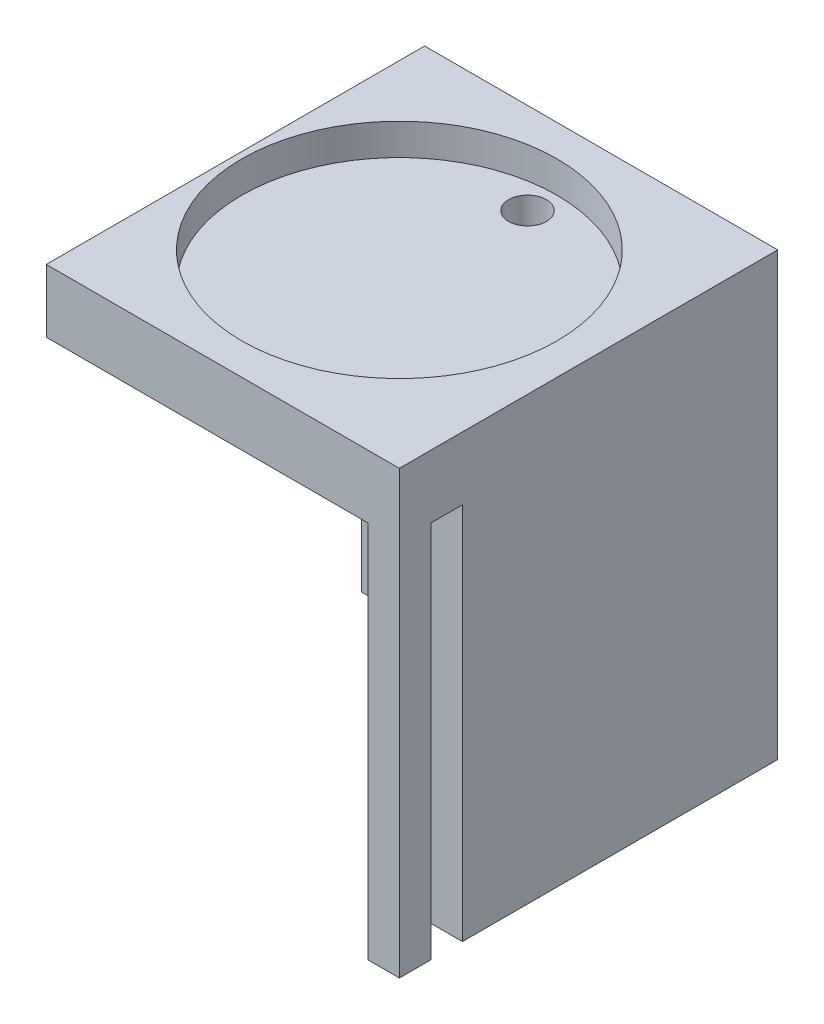
ISO-10303-21;
HEADER;
FILE_DESCRIPTION(('STEP AP214'),'2;1');
FILE_NAME('part.step','',(''),(''),'','','');
FILE_SCHEMA(('AUTOMOTIVE_DESIGN { 1 0 10303 214 1 1 1 1 }'));
ENDSEC;
DATA;
#1=APPLICATION_CONTEXT('core data for automotive mechanical design processes');
#2=APPLICATION_PROTOCOL_DEFINITION('international standard','automotive_design',2000,#1);
#3=PRODUCT_CONTEXT('',#1,'mechanical');
#4=PRODUCT('Part','Part','',(#3));
#5=PRODUCT_RELATED_PRODUCT_CATEGORY('part','',(#4));
#6=PRODUCT_DEFINITION_FORMATION('','',#4);
#7=PRODUCT_DEFINITION_CONTEXT('part definition',#1,'design');
#8=PRODUCT_DEFINITION('design','',#6,#7);
#9=PRODUCT_DEFINITION_SHAPE('','',#8);
#10=(LENGTH_UNIT() NAMED_UNIT(*) SI_UNIT(.MILLI.,.METRE.));
#11=(NAMED_UNIT(*) PLANE_ANGLE_UNIT() SI_UNIT($,.RADIAN.));
#12=(NAMED_UNIT(*) SI_UNIT($,.STERADIAN.) SOLID_ANGLE_UNIT());
#13=UNCERTAINTY_MEASURE_WITH_UNIT(LENGTH_MEASURE(1.E-05),#10,'distance_accuracy_value','');
#14=(GEOMETRIC_REPRESENTATION_CONTEXT(3) GLOBAL_UNCERTAINTY_ASSIGNED_CONTEXT((#13)) GLOBAL_UNIT_ASSIGNED_CONTEXT((#10,
#11,#12)) REPRESENTATION_CONTEXT('',''));
#15=CARTESIAN_POINT('',(0.,0.,0.));
#16=DIRECTION('',(0.,0.,1.));
#17=DIRECTION('',(1.,0.,0.));
#18=AXIS2_PLACEMENT_3D('',#15,#16,#17);
#19=CARTESIAN_POINT('',(0.,530.,0.));
#20=DIRECTION('',(0.,0.,-1.));
#21=DIRECTION('',(-1.,0.,0.));
#22=AXIS2_PLACEMENT_3D('',#19,#20,#21);
#23=PLANE('',#22);
#24=DIRECTION('',(0.,1.,0.));
#25=VECTOR('',#24,1.);
#26=CARTESIAN_POINT('',(660.,10.,0.));
#27=LINE('',#26,#25);
#28=CARTESIAN_POINT('',(660.,140.,0.));
#29=VERTEX_POINT('',#28);
#30=CARTESIAN_POINT('',(660.,260.,0.));
#31=VERTEX_POINT('',#30);
#32=EDGE_CURVE('E282',#29,#31,#27,.T.);
#33=ORIENTED_EDGE('',*,*,#32,.F.);
#34=DIRECTION('',(-1.,0.,0.));
#35=VECTOR('',#34,1.);
#36=CARTESIAN_POINT('',(670.,140.,0.));
#37=LINE('',#36,#35);
#38=CARTESIAN_POINT('',(670.,140.,0.));
#39=VERTEX_POINT('',#38);
#40=EDGE_CURVE('E172',#39,#29,#37,.T.);
#41=ORIENTED_EDGE('',*,*,#40,.F.);
#42=DIRECTION('',(0.,-1.,0.));
#43=VECTOR('',#42,1.);
#44=CARTESIAN_POINT('',(670.,530.,0.));
#45=LINE('',#44,#43);
#46=CARTESIAN_POINT('',(670.,280.,0.));
#47=VERTEX_POINT('',#46);
#48=EDGE_CURVE('E305',#47,#39,#45,.T.);
#49=ORIENTED_EDGE('',*,*,#48,.F.);
#50=DIRECTION('',(-1.,0.,0.));
#51=VECTOR('',#50,1.);
#52=CARTESIAN_POINT('',(0.,280.,0.));
#53=LINE('',#52,#51);
#54=CARTESIAN_POINT('',(558.,280.,0.));
#55=VERTEX_POINT('',#54);
#56=EDGE_CURVE('E194',#47,#55,#53,.T.);
#57=ORIENTED_EDGE('',*,*,#56,.T.);
#58=DIRECTION('',(0.,-1.,0.));
#59=VECTOR('',#58,1.);
#60=CARTESIAN_POINT('',(558.,0.,0.));
#61=LINE('',#60,#59);
#62=CARTESIAN_POINT('',(558.,260.,0.));
#63=VERTEX_POINT('',#62);
#64=EDGE_CURVE('E371',#55,#63,#61,.T.);
#65=ORIENTED_EDGE('',*,*,#64,.T.);
#66=DIRECTION('',(-1.,0.,0.));
#67=VECTOR('',#66,1.);
#68=CARTESIAN_POINT('',(9.99999999999982,260.,0.));
#69=LINE('',#68,#67);
#70=EDGE_CURVE('E287',#31,#63,#69,.T.);
#71=ORIENTED_EDGE('',*,*,#70,.F.);
#72=EDGE_LOOP('',(#33,#41,#49,#57,#65,#71));
#73=FACE_BOUND('',#72,.T.);
#74=ADVANCED_FACE('F38',(#73),#23,.F.);
#75=CARTESIAN_POINT('',(660.,10.,-100.));
#76=DIRECTION('',(1.,0.,0.));
#77=DIRECTION('',(0.,0.,-1.));
#78=AXIS2_PLACEMENT_3D('',#75,#76,#77);
#79=PLANE('',#78);
#80=DIRECTION('',(0.,-1.,0.));
#81=VECTOR('',#80,1.);
#82=CARTESIAN_POINT('',(660.,10.,-9.99999999999999));
#83=LINE('',#82,#81);
#84=CARTESIAN_POINT('',(660.,260.,-10.));
#85=VERTEX_POINT('',#84);
#86=CARTESIAN_POINT('',(660.,140.,-9.99999999999999));
#87=VERTEX_POINT('',#86);
#88=EDGE_CURVE('E259',#85,#87,#83,.T.);
#89=ORIENTED_EDGE('',*,*,#88,.T.);
#90=DIRECTION('',(0.,0.,1.));
#91=VECTOR('',#90,1.);
#92=CARTESIAN_POINT('',(660.,140.,-100.));
#93=LINE('',#92,#91);
#94=EDGE_CURVE('E53',#87,#29,#93,.T.);
#95=ORIENTED_EDGE('',*,*,#94,.T.);
#96=ORIENTED_EDGE('',*,*,#32,.T.);
#97=DIRECTION('',(0.,0.,1.));
#98=VECTOR('',#97,1.);
#99=CARTESIAN_POINT('',(660.,260.,-100.));
#100=LINE('',#99,#98);
#101=EDGE_CURVE('E292',#85,#31,#100,.T.);
#102=ORIENTED_EDGE('',*,*,#101,.F.);
#103=EDGE_LOOP('',(#89,#95,#96,#102));
#104=FACE_BOUND('',#103,.T.);
#105=ADVANCED_FACE('F340',(#104),#79,.F.);
#106=CARTESIAN_POINT('',(670.,530.,0.));
#107=DIRECTION('',(-1.,0.,0.));
#108=DIRECTION('',(0.,0.,1.));
#109=AXIS2_PLACEMENT_3D('',#106,#107,#108);
#110=PLANE('',#109);
#111=ORIENTED_EDGE('',*,*,#48,.T.);
#112=DIRECTION('',(0.,0.,-1.));
#113=VECTOR('',#112,1.);
#114=CARTESIAN_POINT('',(670.,140.,-120.));
#115=LINE('',#114,#113);
#116=CARTESIAN_POINT('',(670.,140.,-9.99999999999999));
#117=VERTEX_POINT('',#116);
#118=EDGE_CURVE('E393',#39,#117,#115,.T.);
#119=ORIENTED_EDGE('',*,*,#118,.T.);
#120=DIRECTION('',(0.,-1.,0.));
#121=VECTOR('',#120,1.);
#122=CARTESIAN_POINT('',(670.,10.,-10.));
#123=LINE('',#122,#121);
#124=CARTESIAN_POINT('',(670.,260.,-10.));
#125=VERTEX_POINT('',#124);
#126=EDGE_CURVE('E238',#125,#117,#123,.T.);
#127=ORIENTED_EDGE('',*,*,#126,.F.);
#128=DIRECTION('',(0.,0.,1.));
#129=VECTOR('',#128,1.);
#130=CARTESIAN_POINT('',(670.,260.,-10.));
#131=LINE('',#130,#129);
#132=CARTESIAN_POINT('',(670.,260.,-20.));
#133=VERTEX_POINT('',#132);
#134=EDGE_CURVE('E245',#133,#125,#131,.T.);
#135=ORIENTED_EDGE('',*,*,#134,.F.);
#136=DIRECTION('',(0.,1.,0.));
#137=VECTOR('',#136,1.);
#138=CARTESIAN_POINT('',(670.,10.,-20.));
#139=LINE('',#138,#137);
#140=CARTESIAN_POINT('',(670.,140.,-20.));
#141=VERTEX_POINT('',#140);
#142=EDGE_CURVE('E242',#141,#133,#139,.T.);
#143=ORIENTED_EDGE('',*,*,#142,.F.);
#144=CARTESIAN_POINT('',(670.,140.,-120.));
#145=VERTEX_POINT('',#144);
#146=EDGE_CURVE('E397',#141,#145,#115,.T.);
#147=ORIENTED_EDGE('',*,*,#146,.T.);
#148=DIRECTION('',(0.,-1.,0.));
#149=VECTOR('',#148,1.);
#150=CARTESIAN_POINT('',(670.,530.,-120.));
#151=LINE('',#150,#149);
#152=CARTESIAN_POINT('',(670.,280.,-120.));
#153=VERTEX_POINT('',#152);
#154=EDGE_CURVE('E169',#153,#145,#151,.T.);
#155=ORIENTED_EDGE('',*,*,#154,.F.);
#156=DIRECTION('',(0.,0.,1.));
#157=VECTOR('',#156,1.);
#158=CARTESIAN_POINT('',(670.,280.,-120.));
#159=LINE('',#158,#157);
#160=EDGE_CURVE('E184',#153,#47,#159,.T.);
#161=ORIENTED_EDGE('',*,*,#160,.T.);
#162=EDGE_LOOP('',(#111,#119,#127,#135,#143,#147,#155,#161));
#163=FACE_BOUND('',#162,.T.);
#164=ADVANCED_FACE('F342',(#163),#110,.F.);
#165=CARTESIAN_POINT('',(0.,530.,-120.));
#166=DIRECTION('',(0.,0.,1.));
#167=DIRECTION('',(1.,0.,0.));
#168=AXIS2_PLACEMENT_3D('',#165,#166,#167);
#169=PLANE('',#168);
#170=DIRECTION('',(0.,1.,0.));
#171=VECTOR('',#170,1.);
#172=CARTESIAN_POINT('',(645.198613037107,530.,-120.));
#173=LINE('',#172,#171);
#174=CARTESIAN_POINT('',(645.198613037107,230.,-120.));
#175=VERTEX_POINT('',#174);
#176=CARTESIAN_POINT('',(645.198613037107,260.,-120.));
#177=VERTEX_POINT('',#176);
#178=EDGE_CURVE('E230',#175,#177,#173,.T.);
#179=ORIENTED_EDGE('',*,*,#178,.T.);
#180=DIRECTION('',(-1.,0.,0.));
#181=VECTOR('',#180,1.);
#182=CARTESIAN_POINT('',(0.,260.,-120.));
#183=LINE('',#182,#181);
#184=CARTESIAN_POINT('',(625.198613037107,260.,-120.));
#185=VERTEX_POINT('',#184);
#186=EDGE_CURVE('E234',#177,#185,#183,.T.);
#187=ORIENTED_EDGE('',*,*,#186,.T.);
#188=DIRECTION('',(0.,-1.,0.));
#189=VECTOR('',#188,1.);
#190=CARTESIAN_POINT('',(625.198613037106,530.000000000002,-120.));
#191=LINE('',#190,#189);
#192=CARTESIAN_POINT('',(625.198613037107,230.,-120.));
#193=VERTEX_POINT('',#192);
#194=EDGE_CURVE('E214',#185,#193,#191,.T.);
#195=ORIENTED_EDGE('',*,*,#194,.T.);
#196=DIRECTION('',(1.,0.,0.));
#197=VECTOR('',#196,1.);
#198=CARTESIAN_POINT('',(0.,230.,-120.));
#199=LINE('',#198,#197);
#200=EDGE_CURVE('E226',#193,#175,#199,.T.);
#201=ORIENTED_EDGE('',*,*,#200,.T.);
#202=EDGE_LOOP('',(#179,#187,#195,#201));
#203=FACE_BOUND('',#202,.T.);
#204=ORIENTED_EDGE('',*,*,#154,.T.);
#205=DIRECTION('',(-1.,0.,0.));
#206=VECTOR('',#205,1.);
#207=CARTESIAN_POINT('',(670.,140.,-120.));
#208=LINE('',#207,#206);
#209=CARTESIAN_POINT('',(558.,140.,-120.));
#210=VERTEX_POINT('',#209);
#211=EDGE_CURVE('E158',#145,#210,#208,.T.);
#212=ORIENTED_EDGE('',*,*,#211,.T.);
#213=DIRECTION('',(0.,1.,0.));
#214=VECTOR('',#213,1.);
#215=CARTESIAN_POINT('',(558.,530.,-120.));
#216=LINE('',#215,#214);
#217=CARTESIAN_POINT('',(558.,280.,-120.));
#218=VERTEX_POINT('',#217);
#219=EDGE_CURVE('E166',#210,#218,#216,.T.);
#220=ORIENTED_EDGE('',*,*,#219,.T.);
#221=DIRECTION('',(1.,0.,0.));
#222=VECTOR('',#221,1.);
#223=CARTESIAN_POINT('',(0.,280.,-120.));
#224=LINE('',#223,#222);
#225=EDGE_CURVE('E179',#218,#153,#224,.T.);
#226=ORIENTED_EDGE('',*,*,#225,.T.);
#227=EDGE_LOOP('',(#204,#212,#220,#226));
#228=FACE_BOUND('',#227,.T.);
#229=ADVANCED_FACE('F165',(#203,#228),#169,.F.);
#230=CARTESIAN_POINT('',(9.99999999999982,260.,-100.));
#231=DIRECTION('',(0.,1.,0.));
#232=DIRECTION('',(0.,0.,1.));
#233=AXIS2_PLACEMENT_3D('',#230,#231,#232);
#234=PLANE('',#233);
#235=ORIENTED_EDGE('',*,*,#70,.T.);
#236=DIRECTION('',(0.,0.,-1.));
#237=VECTOR('',#236,1.);
#238=CARTESIAN_POINT('',(558.,260.,-100.));
#239=LINE('',#238,#237);
#240=CARTESIAN_POINT('',(558.,260.,-100.));
#241=VERTEX_POINT('',#240);
#242=EDGE_CURVE('E180',#63,#241,#239,.T.);
#243=ORIENTED_EDGE('',*,*,#242,.T.);
#244=DIRECTION('',(-1.,0.,0.));
#245=VECTOR('',#244,1.);
#246=CARTESIAN_POINT('',(9.99999999999982,260.,-100.));
#247=LINE('',#246,#245);
#248=CARTESIAN_POINT('',(603.622470889696,260.,-100.));
#249=VERTEX_POINT('',#248);
#250=EDGE_CURVE('E286',#249,#241,#247,.T.);
#251=ORIENTED_EDGE('',*,*,#250,.F.);
#252=CARTESIAN_POINT('',(609.516497097688,260.,-101.122699897348));
#253=DIRECTION('',(0.,1.,0.));
#254=DIRECTION('',(0.,0.,1.));
#255=AXIS2_PLACEMENT_3D('',#252,#253,#254);
#256=CIRCLE('',#255,6.00000000000001);
#257=CARTESIAN_POINT('',(615.41052330568,260.,-100.));
#258=VERTEX_POINT('',#257);
#259=EDGE_CURVE('E270',#249,#258,#256,.T.);
#260=ORIENTED_EDGE('',*,*,#259,.T.);
#261=CARTESIAN_POINT('',(625.198613037107,260.,-100.));
#262=VERTEX_POINT('',#261);
#263=EDGE_CURVE('E293',#262,#258,#247,.T.);
#264=ORIENTED_EDGE('',*,*,#263,.F.);
#265=DIRECTION('',(0.,0.,1.));
#266=VECTOR('',#265,1.);
#267=CARTESIAN_POINT('',(625.198613037107,260.,-180.));
#268=LINE('',#267,#266);
#269=EDGE_CURVE('E210',#185,#262,#268,.T.);
#270=ORIENTED_EDGE('',*,*,#269,.F.);
#271=ORIENTED_EDGE('',*,*,#186,.F.);
#272=DIRECTION('',(0.,0.,1.));
#273=VECTOR('',#272,1.);
#274=CARTESIAN_POINT('',(645.198613037107,260.,-180.));
#275=LINE('',#274,#273);
#276=CARTESIAN_POINT('',(645.198613037107,260.,-100.));
#277=VERTEX_POINT('',#276);
#278=EDGE_CURVE('E211',#177,#277,#275,.T.);
#279=ORIENTED_EDGE('',*,*,#278,.T.);
#280=CARTESIAN_POINT('',(660.,260.,-100.));
#281=VERTEX_POINT('',#280);
#282=EDGE_CURVE('E288',#281,#277,#247,.T.);
#283=ORIENTED_EDGE('',*,*,#282,.F.);
#284=CARTESIAN_POINT('',(660.,260.,-20.));
#285=VERTEX_POINT('',#284);
#286=EDGE_CURVE('E299',#281,#285,#100,.T.);
#287=ORIENTED_EDGE('',*,*,#286,.T.);
#288=DIRECTION('',(1.,0.,0.));
#289=VECTOR('',#288,1.);
#290=CARTESIAN_POINT('',(-47.0000000000002,260.,-20.));
#291=LINE('',#290,#289);
#292=EDGE_CURVE('E249',#285,#133,#291,.T.);
#293=ORIENTED_EDGE('',*,*,#292,.T.);
#294=ORIENTED_EDGE('',*,*,#134,.T.);
#295=DIRECTION('',(1.,0.,0.));
#296=VECTOR('',#295,1.);
#297=CARTESIAN_POINT('',(-47.0000000000002,260.,-10.));
#298=LINE('',#297,#296);
#299=EDGE_CURVE('E250',#85,#125,#298,.T.);
#300=ORIENTED_EDGE('',*,*,#299,.F.);
#301=ORIENTED_EDGE('',*,*,#101,.T.);
#302=EDGE_LOOP('',(#235,#243,#251,#260,#264,#270,#271,#279,#283,#287,#293,#294,#300,#301));
#303=FACE_BOUND('',#302,.T.);
#304=ADVANCED_FACE('F333',(#303),#234,.F.);
#305=DIRECTION('',(0.,1.,0.));
#306=VECTOR('',#305,1.);
#307=CARTESIAN_POINT('',(660.,10.,-100.));
#308=LINE('',#307,#306);
#309=CARTESIAN_POINT('',(660.,140.,-100.));
#310=VERTEX_POINT('',#309);
#311=EDGE_CURVE('E283',#310,#281,#308,.T.);
#312=ORIENTED_EDGE('',*,*,#311,.F.);
#313=DIRECTION('',(0.,0.,1.));
#314=VECTOR('',#313,1.);
#315=CARTESIAN_POINT('',(660.,140.,-100.));
#316=LINE('',#315,#314);
#317=CARTESIAN_POINT('',(660.,140.,-20.));
#318=VERTEX_POINT('',#317);
#319=EDGE_CURVE('E377',#310,#318,#316,.T.);
#320=ORIENTED_EDGE('',*,*,#319,.T.);
#321=DIRECTION('',(0.,1.,0.));
#322=VECTOR('',#321,1.);
#323=CARTESIAN_POINT('',(660.,10.,-20.));
#324=LINE('',#323,#322);
#325=EDGE_CURVE('E253',#318,#285,#324,.T.);
#326=ORIENTED_EDGE('',*,*,#325,.T.);
#327=ORIENTED_EDGE('',*,*,#286,.F.);
#328=EDGE_LOOP('',(#312,#320,#326,#327));
#329=FACE_BOUND('',#328,.T.);
#330=ADVANCED_FACE('F330',(#329),#79,.F.);
#331=CARTESIAN_POINT('',(0.,0.,-100.));
#332=DIRECTION('',(0.,0.,-1.));
#333=DIRECTION('',(-1.,0.,0.));
#334=AXIS2_PLACEMENT_3D('',#331,#332,#333);
#335=PLANE('',#334);
#336=DIRECTION('',(0.,-1.,0.));
#337=VECTOR('',#336,1.);
#338=CARTESIAN_POINT('',(558.,0.,-100.));
#339=LINE('',#338,#337);
#340=CARTESIAN_POINT('',(558.,140.,-100.));
#341=VERTEX_POINT('',#340);
#342=EDGE_CURVE('E187',#241,#341,#339,.T.);
#343=ORIENTED_EDGE('',*,*,#342,.T.);
#344=DIRECTION('',(1.,0.,0.));
#345=VECTOR('',#344,1.);
#346=CARTESIAN_POINT('',(0.,140.,-100.));
#347=LINE('',#346,#345);
#348=EDGE_CURVE('E61',#341,#310,#347,.T.);
#349=ORIENTED_EDGE('',*,*,#348,.T.);
#350=ORIENTED_EDGE('',*,*,#311,.T.);
#351=ORIENTED_EDGE('',*,*,#282,.T.);
#352=DIRECTION('',(0.,1.,0.));
#353=VECTOR('',#352,1.);
#354=CARTESIAN_POINT('',(645.198613037107,260.,-100.));
#355=LINE('',#354,#353);
#356=CARTESIAN_POINT('',(645.198613037107,230.,-100.));
#357=VERTEX_POINT('',#356);
#358=EDGE_CURVE('E206',#357,#277,#355,.T.);
#359=ORIENTED_EDGE('',*,*,#358,.F.);
#360=DIRECTION('',(1.,0.,0.));
#361=VECTOR('',#360,1.);
#362=CARTESIAN_POINT('',(625.198613037107,230.,-100.));
#363=LINE('',#362,#361);
#364=CARTESIAN_POINT('',(625.198613037107,230.,-100.));
#365=VERTEX_POINT('',#364);
#366=EDGE_CURVE('E202',#365,#357,#363,.T.);
#367=ORIENTED_EDGE('',*,*,#366,.F.);
#368=DIRECTION('',(0.,-1.,0.));
#369=VECTOR('',#368,1.);
#370=CARTESIAN_POINT('',(625.198613037107,260.,-100.));
#371=LINE('',#370,#369);
#372=EDGE_CURVE('E198',#262,#365,#371,.T.);
#373=ORIENTED_EDGE('',*,*,#372,.F.);
#374=ORIENTED_EDGE('',*,*,#263,.T.);
#375=DIRECTION('',(0.,1.,0.));
#376=VECTOR('',#375,1.);
#377=CARTESIAN_POINT('',(615.41052330568,270.,-100.));
#378=LINE('',#377,#376);
#379=CARTESIAN_POINT('',(615.41052330568,240.,-100.));
#380=VERTEX_POINT('',#379);
#381=EDGE_CURVE('E319',#258,#380,#378,.F.);
#382=ORIENTED_EDGE('',*,*,#381,.T.);
#383=CARTESIAN_POINT('',(579.010817110295,254.736907236427,-100.));
#384=CARTESIAN_POINT('',(580.064485461513,254.104231159984,-100.));
#385=CARTESIAN_POINT('',(581.118170531218,253.471582920944,-100.));
#386=CARTESIAN_POINT('',(583.225597589703,252.206377004348,-100.));
#387=CARTESIAN_POINT('',(584.279339578581,251.573819326955,-100.));
#388=CARTESIAN_POINT('',(586.386955671744,250.308798381958,-100.));
#389=CARTESIAN_POINT('',(587.440829780064,249.676335121075,-100.));
#390=CARTESIAN_POINT('',(589.548693446274,248.4116051581,-100.));
#391=CARTESIAN_POINT('',(590.60268300396,247.779338455669,-100.));
#392=CARTESIAN_POINT('',(592.725203257284,246.506508418519,-100.));
#393=CARTESIAN_POINT('',(593.793736513587,245.865949352983,-100.));
#394=CARTESIAN_POINT('',(595.396801974486,244.905547487372,-100.));
#395=CARTESIAN_POINT('',(595.931202829409,244.585485460179,-100.));
#396=CARTESIAN_POINT('',(597.000130148606,243.945571848214,-100.));
#397=CARTESIAN_POINT('',(597.534656612814,243.625720263332,-100.));
#398=CARTESIAN_POINT('',(598.603873229973,242.986336773128,-100.));
#399=CARTESIAN_POINT('',(599.138563375945,242.66680485614,-100.));
#400=CARTESIAN_POINT('',(600.208232950862,242.028223143499,-100.));
#401=CARTESIAN_POINT('',(600.743212380385,241.709173348814,-100.));
#402=CARTESIAN_POINT('',(601.81364134488,241.071874121645,-100.));
#403=CARTESIAN_POINT('',(602.34909087527,240.753624681475,-100.));
#404=CARTESIAN_POINT('',(603.152947508334,240.277403948793,-100.));
#405=CARTESIAN_POINT('',(603.421013010738,240.118856196473,-100.));
#406=CARTESIAN_POINT('',(603.957480419703,239.802331010719,-100.));
#407=CARTESIAN_POINT('',(604.225882325852,239.644353576585,-100.));
#408=CARTESIAN_POINT('',(604.5988037609,239.425679597394,-100.));
#409=CARTESIAN_POINT('',(604.703103960806,239.364609073491,-100.));
#410=CARTESIAN_POINT('',(604.911799643123,239.242630970474,-100.));
#411=CARTESIAN_POINT('',(605.016195125588,239.181723391454,-100.));
#412=CARTESIAN_POINT('',(605.329557735671,238.99928928014,-100.));
#413=CARTESIAN_POINT('',(605.538695259016,238.878054759873,-100.));
#414=CARTESIAN_POINT('',(605.957248937048,238.637032006426,-100.));
#415=CARTESIAN_POINT('',(606.166663710999,238.517241376926,-100.));
#416=CARTESIAN_POINT('',(606.586596892621,238.279629821976,-100.));
#417=CARTESIAN_POINT('',(606.797115226832,238.16180876755,-100.));
#418=CARTESIAN_POINT('',(607.121248849038,237.98406405024,-100.));
#419=CARTESIAN_POINT('',(607.234143678677,237.922830440583,-100.));
#420=CARTESIAN_POINT('',(607.46077225373,237.801893621931,-100.));
#421=CARTESIAN_POINT('',(607.574506113992,237.74219062765,-100.));
#422=CARTESIAN_POINT('',(607.803670197733,237.624852792922,-100.));
#423=CARTESIAN_POINT('',(607.919105626286,237.56722799868,-100.));
#424=CARTESIAN_POINT('',(608.093628278135,237.483670531972,-100.));
#425=CARTESIAN_POINT('',(608.152025388404,237.456300349025,-100.));
#426=CARTESIAN_POINT('',(608.269393827435,237.402824133321,-100.));
#427=CARTESIAN_POINT('',(608.32836512168,237.376718025134,-100.));
#428=CARTESIAN_POINT('',(608.455620218305,237.322502742292,-100.));
#429=CARTESIAN_POINT('',(608.524015027124,237.294651600535,-100.));
#430=CARTESIAN_POINT('',(608.661996793455,237.241982702947,-100.));
#431=CARTESIAN_POINT('',(608.731584008968,237.217165613289,-100.));
#432=CARTESIAN_POINT('',(608.871583518835,237.171995701995,-100.));
#433=CARTESIAN_POINT('',(608.94198419481,237.151607584979,-100.));
#434=CARTESIAN_POINT('',(609.084227469,237.116649935087,-100.));
#435=CARTESIAN_POINT('',(609.156069226653,237.102077108254,-100.));
#436=CARTESIAN_POINT('',(609.287399091293,237.082470862284,-100.));
#437=CARTESIAN_POINT('',(609.346693412188,237.076165525243,-100.));
#438=CARTESIAN_POINT('',(609.465608604954,237.069180337324,-100.));
#439=CARTESIAN_POINT('',(609.525229378342,237.06849887434,-100.));
#440=CARTESIAN_POINT('',(609.644452946972,237.072843524842,-100.));
#441=CARTESIAN_POINT('',(609.704055030317,237.077888526484,-100.));
#442=CARTESIAN_POINT('',(609.822574241125,237.093174999284,-100.));
#443=CARTESIAN_POINT('',(609.881491270088,237.103417208497,-100.));
#444=CARTESIAN_POINT('',(610.024595428082,237.133756118527,-100.));
#445=CARTESIAN_POINT('',(610.108273960249,237.156212095037,-100.));
#446=CARTESIAN_POINT('',(610.273722153184,237.207397218453,-100.));
#447=CARTESIAN_POINT('',(610.355489262582,237.236134273028,-100.));
#448=CARTESIAN_POINT('',(610.517738468658,237.297926782164,-100.));
#449=CARTESIAN_POINT('',(610.598213800607,237.330999712354,-100.));
#450=CARTESIAN_POINT('',(610.757877063554,237.399982605282,-100.));
#451=CARTESIAN_POINT('',(610.837065595083,237.435891195963,-100.));
#452=CARTESIAN_POINT('',(610.995898460792,237.510331232749,-100.));
#453=CARTESIAN_POINT('',(611.075526249826,237.548897740089,-100.));
#454=CARTESIAN_POINT('',(611.234068814276,237.627480152907,-100.));
#455=CARTESIAN_POINT('',(611.312983523433,237.667496191376,-100.));
#456=CARTESIAN_POINT('',(611.470052941163,237.748469154222,-100.));
#457=CARTESIAN_POINT('',(611.548209141397,237.789423194045,-100.));
#458=CARTESIAN_POINT('',(611.704101015729,237.872114700255,-100.));
#459=CARTESIAN_POINT('',(611.781836706502,237.91385213528,-100.));
#460=CARTESIAN_POINT('',(612.036169390439,238.051654366385,-100.));
#461=CARTESIAN_POINT('',(612.212096425044,238.148954096322,-100.));
#462=CARTESIAN_POINT('',(612.56296671254,238.345314180964,-100.));
#463=CARTESIAN_POINT('',(612.737909930497,238.444374597676,-100.));
#464=CARTESIAN_POINT('',(613.087172450907,238.643626644001,-100.));
#465=CARTESIAN_POINT('',(613.261491692711,238.743818379844,-100.));
#466=CARTESIAN_POINT('',(613.609695952904,238.944954098754,-100.));
#467=CARTESIAN_POINT('',(613.783580969298,239.045898085268,-100.));
#468=CARTESIAN_POINT('',(614.305198668206,239.34974757573,-100.));
#469=CARTESIAN_POINT('',(614.652477687977,239.553431413879,-100.));
#470=CARTESIAN_POINT('',(615.346361772551,239.961897744248,-100.));
#471=CARTESIAN_POINT('',(615.692966873269,240.166680175605,-100.));
#472=CARTESIAN_POINT('',(616.380412247215,240.573753442597,-100.));
#473=CARTESIAN_POINT('',(616.721258728453,240.776033795877,-100.));
#474=CARTESIAN_POINT('',(617.402700541204,241.181028276847,-100.));
#475=CARTESIAN_POINT('',(617.743295868938,241.383742410893,-100.));
#476=CARTESIAN_POINT('',(618.42416548712,241.789382073193,-100.));
#477=CARTESIAN_POINT('',(618.764439852417,241.992307475828,-100.));
#478=CARTESIAN_POINT('',(619.444859218411,242.398371527395,-100.));
#479=CARTESIAN_POINT('',(619.785004219683,242.601510175362,-100.));
#480=CARTESIAN_POINT('',(620.976724023493,243.313586072234,-100.));
#481=CARTESIAN_POINT('',(621.828055975153,243.822929712478,-100.));
#482=CARTESIAN_POINT('',(623.530419574978,244.842121616094,-100.));
#483=CARTESIAN_POINT('',(624.381451222634,245.351969880318,-100.));
#484=CARTESIAN_POINT('',(626.934583078903,246.882135475321,-100.));
#485=CARTESIAN_POINT('',(628.636419167318,247.902893472661,-100.));
#486=CARTESIAN_POINT('',(632.089080343556,249.974468165039,-100.));
#487=CARTESIAN_POINT('',(633.839896801331,251.025299238028,-100.));
#488=CARTESIAN_POINT('',(636.465834890892,252.601661847611,-100.));
#489=CARTESIAN_POINT('',(637.341020081696,253.127087498659,-100.));
#490=CARTESIAN_POINT('',(639.091357625422,254.177993150883,-100.));
#491=CARTESIAN_POINT('',(639.966509978348,254.703473152052,-100.));
#492=CARTESIAN_POINT('',(640.841650821006,255.228972316307,-100.));
#493=B_SPLINE_CURVE_WITH_KNOTS('',3,(#383,#384,#385,#386,#387,#388,#389,#390,#391,#392,#393,
#394,#395,#396,#397,#398,#399,#400,#401,#402,#403,#404,#405,#406,#407,#408,#409,#410,#411,#412,
#413,#414,#415,#416,#417,#418,#419,#420,#421,#422,#423,#424,#425,#426,#427,#428,#429,#430,#431,
#432,#433,#434,#435,#436,#437,#438,#439,#440,#441,#442,#443,#444,#445,#446,#447,#448,#449,#450,
#451,#452,#453,#454,#455,#456,#457,#458,#459,#460,#461,#462,#463,#464,#465,#466,#467,#468,#469,
#470,#471,#472,#473,#474,#475,#476,#477,#478,#479,#480,#481,#482,#483,#484,#485,#486,#487,#488,
#489,#490,#491,#492),.UNSPECIFIED.,.F.,.F.,(4,2,2,2,2,2,2,2,2,2,2,2,2,2,2,2,2,2,2,2,2,2,2,2,2,2,
2,2,2,2,2,2,2,2,2,2,2,2,2,2,2,2,2,2,2,2,2,2,2,2,2,2,2,2,4),(0.,3.68706714570591,
7.37414085194982,11.0614086203671,14.7486699862425,18.4861440267546,20.3548911054658,
22.2236372069734,24.0923124200723,25.9609913771879,27.8296523203124,28.7639797875429,
29.6983061075908,30.060898387709,30.4234908768716,31.1486959180865,31.8724590721655,
32.5961746436826,32.9814624312326,33.3668039741919,33.7538098315314,33.947277669537,
34.1407339485546,34.3622273670395,34.5837693307661,34.803475141829,35.0230563276392,
35.2017019872668,35.3802964356112,35.5594816755622,35.7386923687519,35.9982201674631,
36.2580766046668,36.5190145796222,36.7798270624682,37.045234074384,37.3106654986628,
37.5753682448035,37.8400604163947,38.443162345494,39.0462855569078,39.6494658803116,
40.2526489691323,41.4604555281976,42.6681958515785,43.8572465823877,45.0463148541447,
46.2348803744179,47.4234405384703,50.399641261938,53.3758470225277,59.3293109837373,
65.4551936079142,68.5175768421518,71.5799595460392),.UNSPECIFIED.);
#494=CARTESIAN_POINT('',(603.622470889696,240.,-100.));
#495=VERTEX_POINT('',#494);
#496=EDGE_CURVE('E309',#380,#495,#493,.F.);
#497=ORIENTED_EDGE('',*,*,#496,.T.);
#498=DIRECTION('',(0.,1.,0.));
#499=VECTOR('',#498,1.);
#500=CARTESIAN_POINT('',(603.622470889696,270.,-100.));
#501=LINE('',#500,#499);
#502=EDGE_CURVE('E46',#495,#249,#501,.T.);
#503=ORIENTED_EDGE('',*,*,#502,.T.);
#504=ORIENTED_EDGE('',*,*,#250,.T.);
#505=EDGE_LOOP('',(#343,#349,#350,#351,#359,#367,#373,#374,#382,#497,#503,#504));
#506=FACE_BOUND('',#505,.T.);
#507=ADVANCED_FACE('F324',(#506),#335,.F.);
#508=CARTESIAN_POINT('',(340.,280.,-100.));
#509=DIRECTION('',(0.,-1.,0.));
#510=DIRECTION('',(0.,0.,-1.));
#511=AXIS2_PLACEMENT_3D('',#508,#509,#510);
#512=PLANE('',#511);
#513=CARTESIAN_POINT('',(610.,280.,-60.));
#514=DIRECTION('',(0.,-1.,0.));
#515=DIRECTION('',(0.,0.,-1.));
#516=AXIS2_PLACEMENT_3D('',#513,#514,#515);
#517=CIRCLE('',#516,50.);
#518=CARTESIAN_POINT('',(610.,280.,-110.));
#519=VERTEX_POINT('',#518);
#520=EDGE_CURVE('E278',#519,#519,#517,.T.);
#521=ORIENTED_EDGE('',*,*,#520,.T.);
#522=EDGE_LOOP('',(#521));
#523=FACE_BOUND('',#522,.T.);
#524=ORIENTED_EDGE('',*,*,#225,.F.);
#525=DIRECTION('',(0.,0.,-1.));
#526=VECTOR('',#525,1.);
#527=CARTESIAN_POINT('',(558.,280.,0.));
#528=LINE('',#527,#526);
#529=EDGE_CURVE('E176',#55,#218,#528,.T.);
#530=ORIENTED_EDGE('',*,*,#529,.F.);
#531=ORIENTED_EDGE('',*,*,#56,.F.);
#532=ORIENTED_EDGE('',*,*,#160,.F.);
#533=EDGE_LOOP('',(#524,#530,#531,#532));
#534=FACE_BOUND('',#533,.T.);
#535=ADVANCED_FACE('F329',(#523,#534),#512,.F.);
#536=CARTESIAN_POINT('',(610.,270.,-60.));
#537=DIRECTION('',(0.,1.,0.));
#538=DIRECTION('',(0.,0.,1.));
#539=AXIS2_PLACEMENT_3D('',#536,#537,#538);
#540=CYLINDRICAL_SURFACE('',#539,50.);
#541=CARTESIAN_POINT('',(610.,270.,-60.));
#542=DIRECTION('',(0.,1.,0.));
#543=DIRECTION('',(0.,0.,1.));
#544=AXIS2_PLACEMENT_3D('',#541,#542,#543);
#545=CIRCLE('',#544,50.);
#546=CARTESIAN_POINT('',(610.,270.,-9.99999999999997));
#547=VERTEX_POINT('',#546);
#548=EDGE_CURVE('E274',#547,#547,#545,.T.);
#549=ORIENTED_EDGE('',*,*,#548,.F.);
#550=EDGE_LOOP('',(#549));
#551=FACE_BOUND('',#550,.T.);
#552=ORIENTED_EDGE('',*,*,#520,.F.);
#553=EDGE_LOOP('',(#552));
#554=FACE_BOUND('',#553,.T.);
#555=ADVANCED_FACE('F449',(#551,#554),#540,.F.);
#556=CARTESIAN_POINT('',(610.,270.,-60.));
#557=DIRECTION('',(0.,1.,0.));
#558=DIRECTION('',(0.,0.,1.));
#559=AXIS2_PLACEMENT_3D('',#556,#557,#558);
#560=PLANE('',#559);
#561=CARTESIAN_POINT('',(609.516497097688,270.,-101.122699897348));
#562=DIRECTION('',(0.,1.,0.));
#563=DIRECTION('',(0.,0.,1.));
#564=AXIS2_PLACEMENT_3D('',#561,#562,#563);
#565=CIRCLE('',#564,6.00000000000001);
#566=CARTESIAN_POINT('',(609.516497097688,270.,-95.1226998973476));
#567=VERTEX_POINT('',#566);
#568=EDGE_CURVE('E263',#567,#567,#565,.T.);
#569=ORIENTED_EDGE('',*,*,#568,.F.);
#570=EDGE_LOOP('',(#569));
#571=FACE_BOUND('',#570,.T.);
#572=ORIENTED_EDGE('',*,*,#548,.T.);
#573=EDGE_LOOP('',(#572));
#574=FACE_BOUND('',#573,.T.);
#575=ADVANCED_FACE('F442',(#571,#574),#560,.T.);
#576=CARTESIAN_POINT('',(609.516497097688,270.,-101.122699897348));
#577=DIRECTION('',(0.,1.,0.));
#578=DIRECTION('',(0.,0.,1.));
#579=AXIS2_PLACEMENT_3D('',#576,#577,#578);
#580=CYLINDRICAL_SURFACE('',#579,6.00000000000001);
#581=ORIENTED_EDGE('',*,*,#568,.T.);
#582=EDGE_LOOP('',(#581));
#583=FACE_BOUND('',#582,.T.);
#584=CARTESIAN_POINT('',(609.516497097688,240.,-101.122699897348));
#585=DIRECTION('',(0.,1.,0.));
#586=DIRECTION('',(0.,0.,1.));
#587=AXIS2_PLACEMENT_3D('',#584,#585,#586);
#588=CIRCLE('',#587,6.00000000000001);
#589=EDGE_CURVE('E267',#380,#495,#588,.T.);
#590=ORIENTED_EDGE('',*,*,#589,.F.);
#591=ORIENTED_EDGE('',*,*,#381,.F.);
#592=ORIENTED_EDGE('',*,*,#259,.F.);
#593=ORIENTED_EDGE('',*,*,#502,.F.);
#594=EDGE_LOOP('',(#590,#591,#592,#593));
#595=FACE_BOUND('',#594,.T.);
#596=ADVANCED_FACE('F440',(#583,#595),#580,.F.);
#597=CARTESIAN_POINT('',(609.516497097688,240.,-101.122699897348));
#598=DIRECTION('',(0.,1.,0.));
#599=DIRECTION('',(0.,0.,1.));
#600=AXIS2_PLACEMENT_3D('',#597,#598,#599);
#601=CONICAL_SURFACE('',#600,6.00000000000001,1.02974425867666);
#602=CARTESIAN_POINT('',(609.516497097688,236.394836285835,-101.122699897348));
#603=VERTEX_POINT('',#602);
#604=VERTEX_LOOP('',#603);
#605=FACE_BOUND('',#604,.T.);
#606=ORIENTED_EDGE('',*,*,#589,.T.);
#607=ORIENTED_EDGE('',*,*,#496,.F.);
#608=EDGE_LOOP('',(#606,#607));
#609=FACE_BOUND('',#608,.T.);
#610=ADVANCED_FACE('F320',(#605,#609),#601,.F.);
#611=CARTESIAN_POINT('',(-47.0000000000002,10.,-20.));
#612=DIRECTION('',(0.,0.,-1.));
#613=DIRECTION('',(-1.,0.,0.));
#614=AXIS2_PLACEMENT_3D('',#611,#612,#613);
#615=PLANE('',#614);
#616=ORIENTED_EDGE('',*,*,#325,.F.);
#617=DIRECTION('',(1.,0.,0.));
#618=VECTOR('',#617,1.);
#619=CARTESIAN_POINT('',(-47.0000000000002,140.,-20.));
#620=LINE('',#619,#618);
#621=EDGE_CURVE('E384',#318,#141,#620,.T.);
#622=ORIENTED_EDGE('',*,*,#621,.T.);
#623=ORIENTED_EDGE('',*,*,#142,.T.);
#624=ORIENTED_EDGE('',*,*,#292,.F.);
#625=EDGE_LOOP('',(#616,#622,#623,#624));
#626=FACE_BOUND('',#625,.T.);
#627=ADVANCED_FACE('F404',(#626),#615,.F.);
#628=CARTESIAN_POINT('',(-47.0000000000002,10.,-10.));
#629=DIRECTION('',(0.,0.,1.));
#630=DIRECTION('',(1.,0.,0.));
#631=AXIS2_PLACEMENT_3D('',#628,#629,#630);
#632=PLANE('',#631);
#633=ORIENTED_EDGE('',*,*,#126,.T.);
#634=DIRECTION('',(-1.,0.,0.));
#635=VECTOR('',#634,1.);
#636=CARTESIAN_POINT('',(-47.0000000000002,140.,-10.));
#637=LINE('',#636,#635);
#638=EDGE_CURVE('E171',#117,#87,#637,.T.);
#639=ORIENTED_EDGE('',*,*,#638,.T.);
#640=ORIENTED_EDGE('',*,*,#88,.F.);
#641=ORIENTED_EDGE('',*,*,#299,.T.);
#642=EDGE_LOOP('',(#633,#639,#640,#641));
#643=FACE_BOUND('',#642,.T.);
#644=ADVANCED_FACE('F437',(#643),#632,.F.);
#645=CARTESIAN_POINT('',(645.198613037107,260.,-180.));
#646=DIRECTION('',(1.,0.,0.));
#647=DIRECTION('',(0.,0.,-1.));
#648=AXIS2_PLACEMENT_3D('',#645,#646,#647);
#649=PLANE('',#648);
#650=DIRECTION('',(0.,0.,1.));
#651=VECTOR('',#650,1.);
#652=CARTESIAN_POINT('',(645.198613037107,230.,-180.));
#653=LINE('',#652,#651);
#654=EDGE_CURVE('E215',#175,#357,#653,.T.);
#655=ORIENTED_EDGE('',*,*,#654,.T.);
#656=ORIENTED_EDGE('',*,*,#358,.T.);
#657=ORIENTED_EDGE('',*,*,#278,.F.);
#658=ORIENTED_EDGE('',*,*,#178,.F.);
#659=EDGE_LOOP('',(#655,#656,#657,#658));
#660=FACE_BOUND('',#659,.T.);
#661=ADVANCED_FACE('F414',(#660),#649,.F.);
#662=CARTESIAN_POINT('',(625.198613037107,230.,-180.));
#663=DIRECTION('',(0.,-1.,0.));
#664=DIRECTION('',(0.,0.,-1.));
#665=AXIS2_PLACEMENT_3D('',#662,#663,#664);
#666=PLANE('',#665);
#667=DIRECTION('',(0.,0.,1.));
#668=VECTOR('',#667,1.);
#669=CARTESIAN_POINT('',(625.198613037107,230.,-180.));
#670=LINE('',#669,#668);
#671=EDGE_CURVE('E218',#193,#365,#670,.T.);
#672=ORIENTED_EDGE('',*,*,#671,.T.);
#673=ORIENTED_EDGE('',*,*,#366,.T.);
#674=ORIENTED_EDGE('',*,*,#654,.F.);
#675=ORIENTED_EDGE('',*,*,#200,.F.);
#676=EDGE_LOOP('',(#672,#673,#674,#675));
#677=FACE_BOUND('',#676,.T.);
#678=ADVANCED_FACE('F418',(#677),#666,.F.);
#679=CARTESIAN_POINT('',(625.198613037107,260.,-180.));
#680=DIRECTION('',(-1.,0.,0.));
#681=DIRECTION('',(0.,-1.,0.));
#682=AXIS2_PLACEMENT_3D('',#679,#680,#681);
#683=PLANE('',#682);
#684=ORIENTED_EDGE('',*,*,#269,.T.);
#685=ORIENTED_EDGE('',*,*,#372,.T.);
#686=ORIENTED_EDGE('',*,*,#671,.F.);
#687=ORIENTED_EDGE('',*,*,#194,.F.);
#688=EDGE_LOOP('',(#684,#685,#686,#687));
#689=FACE_BOUND('',#688,.T.);
#690=ADVANCED_FACE('F423',(#689),#683,.F.);
#691=CARTESIAN_POINT('',(558.,0.,0.));
#692=DIRECTION('',(1.,0.,0.));
#693=DIRECTION('',(0.,0.,-1.));
#694=AXIS2_PLACEMENT_3D('',#691,#692,#693);
#695=PLANE('',#694);
#696=ORIENTED_EDGE('',*,*,#219,.F.);
#697=DIRECTION('',(0.,0.,1.));
#698=VECTOR('',#697,1.);
#699=CARTESIAN_POINT('',(558.,140.,0.));
#700=LINE('',#699,#698);
#701=EDGE_CURVE('E11',#210,#341,#700,.T.);
#702=ORIENTED_EDGE('',*,*,#701,.T.);
#703=ORIENTED_EDGE('',*,*,#342,.F.);
#704=ORIENTED_EDGE('',*,*,#242,.F.);
#705=ORIENTED_EDGE('',*,*,#64,.F.);
#706=ORIENTED_EDGE('',*,*,#529,.T.);
#707=EDGE_LOOP('',(#696,#702,#703,#704,#705,#706));
#708=FACE_BOUND('',#707,.T.);
#709=ADVANCED_FACE('F174',(#708),#695,.F.);
#710=CARTESIAN_POINT('',(670.,140.,-120.));
#711=DIRECTION('',(0.,1.,0.));
#712=DIRECTION('',(0.,0.,1.));
#713=AXIS2_PLACEMENT_3D('',#710,#711,#712);
#714=PLANE('',#713);
#715=ORIENTED_EDGE('',*,*,#701,.F.);
#716=ORIENTED_EDGE('',*,*,#211,.F.);
#717=ORIENTED_EDGE('',*,*,#146,.F.);
#718=ORIENTED_EDGE('',*,*,#621,.F.);
#719=ORIENTED_EDGE('',*,*,#319,.F.);
#720=ORIENTED_EDGE('',*,*,#348,.F.);
#721=EDGE_LOOP('',(#715,#716,#717,#718,#719,#720));
#722=FACE_BOUND('',#721,.T.);
#723=ADVANCED_FACE('F157',(#722),#714,.F.);
#724=ORIENTED_EDGE('',*,*,#638,.F.);
#725=ORIENTED_EDGE('',*,*,#118,.F.);
#726=ORIENTED_EDGE('',*,*,#40,.T.);
#727=ORIENTED_EDGE('',*,*,#94,.F.);
#728=EDGE_LOOP('',(#724,#725,#726,#727));
#729=FACE_BOUND('',#728,.T.);
#730=ADVANCED_FACE('F554',(#729),#714,.F.);
#731=CLOSED_SHELL('',(#74,#105,#164,#229,#304,#330,#507,#535,#555,#575,#596,#610,#627,#644,#661,
#678,#690,#709,#723,#730));
#732=MANIFOLD_SOLID_BREP('B2',#731);
#733=ADVANCED_BREP_SHAPE_REPRESENTATION('',(#18,#732),#14);
#734=SHAPE_DEFINITION_REPRESENTATION(#9,#733);
ENDSEC;
END-ISO-10303-21;
